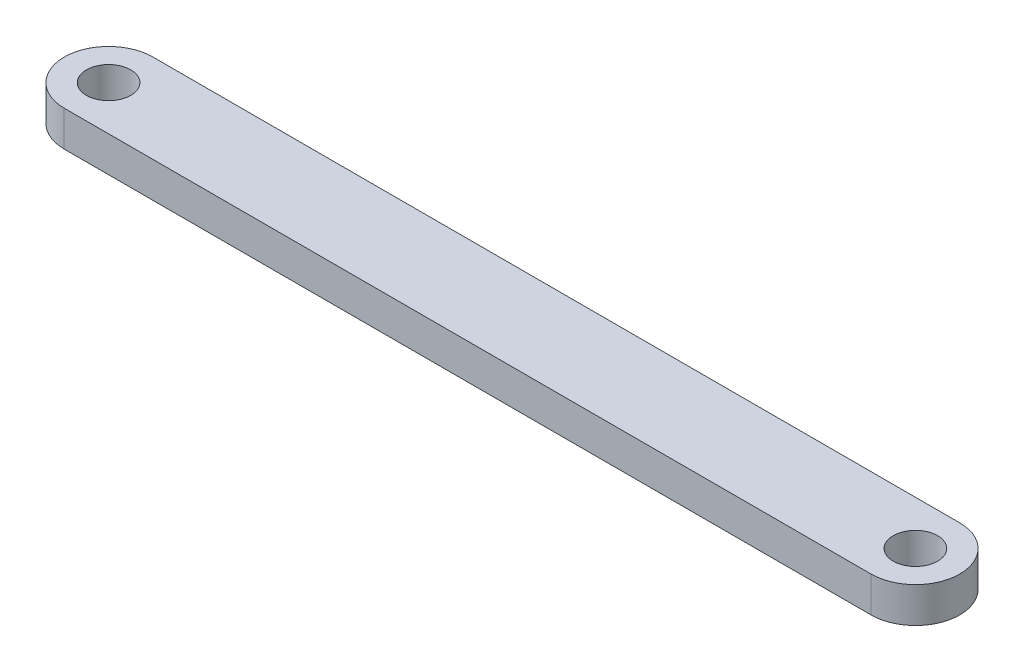
ISO-10303-21;
HEADER;
FILE_DESCRIPTION(('STEP AP214'),'2;1');
FILE_NAME('part.step','',(''),(''),'','','');
FILE_SCHEMA(('AUTOMOTIVE_DESIGN { 1 0 10303 214 1 1 1 1 }'));
ENDSEC;
DATA;
#1=APPLICATION_CONTEXT('core data for automotive mechanical design processes');
#2=APPLICATION_PROTOCOL_DEFINITION('international standard','automotive_design',2000,#1);
#3=PRODUCT_CONTEXT('',#1,'mechanical');
#4=PRODUCT('Part','Part','',(#3));
#5=PRODUCT_RELATED_PRODUCT_CATEGORY('part','',(#4));
#6=PRODUCT_DEFINITION_FORMATION('','',#4);
#7=PRODUCT_DEFINITION_CONTEXT('part definition',#1,'design');
#8=PRODUCT_DEFINITION('design','',#6,#7);
#9=PRODUCT_DEFINITION_SHAPE('','',#8);
#10=(LENGTH_UNIT() NAMED_UNIT(*) SI_UNIT(.MILLI.,.METRE.));
#11=(NAMED_UNIT(*) PLANE_ANGLE_UNIT() SI_UNIT($,.RADIAN.));
#12=(NAMED_UNIT(*) SI_UNIT($,.STERADIAN.) SOLID_ANGLE_UNIT());
#13=UNCERTAINTY_MEASURE_WITH_UNIT(LENGTH_MEASURE(1.E-05),#10,'distance_accuracy_value','');
#14=(GEOMETRIC_REPRESENTATION_CONTEXT(3) GLOBAL_UNCERTAINTY_ASSIGNED_CONTEXT((#13)) GLOBAL_UNIT_ASSIGNED_CONTEXT((#10,
#11,#12)) REPRESENTATION_CONTEXT('',''));
#15=CARTESIAN_POINT('',(0.,0.,0.));
#16=DIRECTION('',(0.,0.,1.));
#17=DIRECTION('',(1.,0.,0.));
#18=AXIS2_PLACEMENT_3D('',#15,#16,#17);
#19=CARTESIAN_POINT('',(0.,20.,25.));
#20=DIRECTION('',(0.,0.,1.));
#21=DIRECTION('',(1.,0.,0.));
#22=AXIS2_PLACEMENT_3D('',#19,#20,#21);
#23=PLANE('',#22);
#24=DIRECTION('',(-1.,0.,0.));
#25=VECTOR('',#24,1.);
#26=CARTESIAN_POINT('',(0.,0.,25.));
#27=LINE('',#26,#25);
#28=CARTESIAN_POINT('',(455.,0.,25.));
#29=VERTEX_POINT('',#28);
#30=CARTESIAN_POINT('',(0.,0.,25.));
#31=VERTEX_POINT('',#30);
#32=EDGE_CURVE('E124',#29,#31,#27,.T.);
#33=ORIENTED_EDGE('',*,*,#32,.F.);
#34=DIRECTION('',(0.,-1.,0.));
#35=VECTOR('',#34,1.);
#36=CARTESIAN_POINT('',(455.,20.,25.));
#37=LINE('',#36,#35);
#38=CARTESIAN_POINT('',(455.,20.,25.));
#39=VERTEX_POINT('',#38);
#40=EDGE_CURVE('E11',#39,#29,#37,.T.);
#41=ORIENTED_EDGE('',*,*,#40,.F.);
#42=DIRECTION('',(-1.,0.,0.));
#43=VECTOR('',#42,1.);
#44=CARTESIAN_POINT('',(0.,20.,25.));
#45=LINE('',#44,#43);
#46=CARTESIAN_POINT('',(0.,20.,25.));
#47=VERTEX_POINT('',#46);
#48=EDGE_CURVE('E97',#39,#47,#45,.T.);
#49=ORIENTED_EDGE('',*,*,#48,.T.);
#50=DIRECTION('',(0.,-1.,0.));
#51=VECTOR('',#50,1.);
#52=CARTESIAN_POINT('',(0.,20.,25.));
#53=LINE('',#52,#51);
#54=EDGE_CURVE('E86',#47,#31,#53,.T.);
#55=ORIENTED_EDGE('',*,*,#54,.T.);
#56=EDGE_LOOP('',(#33,#41,#49,#55));
#57=FACE_BOUND('',#56,.T.);
#58=ADVANCED_FACE('F47',(#57),#23,.T.);
#59=CARTESIAN_POINT('',(455.,20.,0.));
#60=DIRECTION('',(0.,-1.,0.));
#61=DIRECTION('',(0.,0.,-1.));
#62=AXIS2_PLACEMENT_3D('',#59,#60,#61);
#63=CYLINDRICAL_SURFACE('',#62,25.);
#64=CARTESIAN_POINT('',(455.,0.,0.));
#65=DIRECTION('',(0.,1.,0.));
#66=DIRECTION('',(0.,0.,1.));
#67=AXIS2_PLACEMENT_3D('',#64,#65,#66);
#68=CIRCLE('',#67,25.);
#69=CARTESIAN_POINT('',(455.,0.,-25.));
#70=VERTEX_POINT('',#69);
#71=EDGE_CURVE('E104',#29,#70,#68,.T.);
#72=ORIENTED_EDGE('',*,*,#71,.T.);
#73=DIRECTION('',(0.,-1.,0.));
#74=VECTOR('',#73,1.);
#75=CARTESIAN_POINT('',(455.,20.,-25.));
#76=LINE('',#75,#74);
#77=CARTESIAN_POINT('',(455.,20.,-25.));
#78=VERTEX_POINT('',#77);
#79=EDGE_CURVE('E56',#78,#70,#76,.T.);
#80=ORIENTED_EDGE('',*,*,#79,.F.);
#81=CARTESIAN_POINT('',(455.,20.,0.));
#82=DIRECTION('',(0.,1.,0.));
#83=DIRECTION('',(0.,0.,1.));
#84=AXIS2_PLACEMENT_3D('',#81,#82,#83);
#85=CIRCLE('',#84,25.);
#86=EDGE_CURVE('E91',#39,#78,#85,.T.);
#87=ORIENTED_EDGE('',*,*,#86,.F.);
#88=ORIENTED_EDGE('',*,*,#40,.T.);
#89=EDGE_LOOP('',(#72,#80,#87,#88));
#90=FACE_BOUND('',#89,.T.);
#91=ADVANCED_FACE('F102',(#90),#63,.T.);
#92=CARTESIAN_POINT('',(0.,20.,-25.));
#93=DIRECTION('',(0.,0.,-1.));
#94=DIRECTION('',(-1.,0.,0.));
#95=AXIS2_PLACEMENT_3D('',#92,#93,#94);
#96=PLANE('',#95);
#97=DIRECTION('',(1.,0.,0.));
#98=VECTOR('',#97,1.);
#99=CARTESIAN_POINT('',(0.,0.,-25.));
#100=LINE('',#99,#98);
#101=CARTESIAN_POINT('',(0.,0.,-25.));
#102=VERTEX_POINT('',#101);
#103=EDGE_CURVE('E130',#102,#70,#100,.T.);
#104=ORIENTED_EDGE('',*,*,#103,.F.);
#105=DIRECTION('',(0.,-1.,0.));
#106=VECTOR('',#105,1.);
#107=CARTESIAN_POINT('',(0.,20.,-25.));
#108=LINE('',#107,#106);
#109=CARTESIAN_POINT('',(0.,20.,-25.));
#110=VERTEX_POINT('',#109);
#111=EDGE_CURVE('E79',#110,#102,#108,.T.);
#112=ORIENTED_EDGE('',*,*,#111,.F.);
#113=DIRECTION('',(1.,0.,0.));
#114=VECTOR('',#113,1.);
#115=CARTESIAN_POINT('',(0.,20.,-25.));
#116=LINE('',#115,#114);
#117=EDGE_CURVE('E96',#110,#78,#116,.T.);
#118=ORIENTED_EDGE('',*,*,#117,.T.);
#119=ORIENTED_EDGE('',*,*,#79,.T.);
#120=EDGE_LOOP('',(#104,#112,#118,#119));
#121=FACE_BOUND('',#120,.T.);
#122=ADVANCED_FACE('F109',(#121),#96,.T.);
#123=CARTESIAN_POINT('',(455.,20.,0.));
#124=DIRECTION('',(0.,-1.,0.));
#125=DIRECTION('',(0.,0.,-1.));
#126=AXIS2_PLACEMENT_3D('',#123,#124,#125);
#127=CYLINDRICAL_SURFACE('',#126,12.5);
#128=CARTESIAN_POINT('',(455.,20.,0.));
#129=DIRECTION('',(0.,1.,0.));
#130=DIRECTION('',(0.,0.,1.));
#131=AXIS2_PLACEMENT_3D('',#128,#129,#130);
#132=CIRCLE('',#131,12.5);
#133=CARTESIAN_POINT('',(455.,20.,12.5));
#134=VERTEX_POINT('',#133);
#135=EDGE_CURVE('E113',#134,#134,#132,.T.);
#136=ORIENTED_EDGE('',*,*,#135,.T.);
#137=EDGE_LOOP('',(#136));
#138=FACE_BOUND('',#137,.T.);
#139=CARTESIAN_POINT('',(455.,0.,0.));
#140=DIRECTION('',(0.,1.,0.));
#141=DIRECTION('',(0.,0.,1.));
#142=AXIS2_PLACEMENT_3D('',#139,#140,#141);
#143=CIRCLE('',#142,12.5);
#144=CARTESIAN_POINT('',(455.,0.,12.5));
#145=VERTEX_POINT('',#144);
#146=EDGE_CURVE('E136',#145,#145,#143,.T.);
#147=ORIENTED_EDGE('',*,*,#146,.F.);
#148=EDGE_LOOP('',(#147));
#149=FACE_BOUND('',#148,.T.);
#150=ADVANCED_FACE('F157',(#138,#149),#127,.F.);
#151=CARTESIAN_POINT('',(0.,20.,0.));
#152=DIRECTION('',(0.,-1.,0.));
#153=DIRECTION('',(0.,0.,-1.));
#154=AXIS2_PLACEMENT_3D('',#151,#152,#153);
#155=CYLINDRICAL_SURFACE('',#154,25.);
#156=CARTESIAN_POINT('',(0.,0.,0.));
#157=DIRECTION('',(0.,1.,0.));
#158=DIRECTION('',(0.,0.,1.));
#159=AXIS2_PLACEMENT_3D('',#156,#157,#158);
#160=CIRCLE('',#159,25.);
#161=EDGE_CURVE('E133',#102,#31,#160,.T.);
#162=ORIENTED_EDGE('',*,*,#161,.T.);
#163=ORIENTED_EDGE('',*,*,#54,.F.);
#164=CARTESIAN_POINT('',(0.,20.,0.));
#165=DIRECTION('',(0.,1.,0.));
#166=DIRECTION('',(0.,0.,1.));
#167=AXIS2_PLACEMENT_3D('',#164,#165,#166);
#168=CIRCLE('',#167,25.);
#169=EDGE_CURVE('E64',#110,#47,#168,.T.);
#170=ORIENTED_EDGE('',*,*,#169,.F.);
#171=ORIENTED_EDGE('',*,*,#111,.T.);
#172=EDGE_LOOP('',(#162,#163,#170,#171));
#173=FACE_BOUND('',#172,.T.);
#174=ADVANCED_FACE('F160',(#173),#155,.T.);
#175=CARTESIAN_POINT('',(0.,20.,0.));
#176=DIRECTION('',(0.,-1.,0.));
#177=DIRECTION('',(0.,0.,-1.));
#178=AXIS2_PLACEMENT_3D('',#175,#176,#177);
#179=CYLINDRICAL_SURFACE('',#178,12.5);
#180=CARTESIAN_POINT('',(0.,20.,0.));
#181=DIRECTION('',(0.,1.,0.));
#182=DIRECTION('',(0.,0.,1.));
#183=AXIS2_PLACEMENT_3D('',#180,#181,#182);
#184=CIRCLE('',#183,12.5);
#185=CARTESIAN_POINT('',(0.,20.,12.5));
#186=VERTEX_POINT('',#185);
#187=EDGE_CURVE('E120',#186,#186,#184,.T.);
#188=ORIENTED_EDGE('',*,*,#187,.T.);
#189=EDGE_LOOP('',(#188));
#190=FACE_BOUND('',#189,.T.);
#191=CARTESIAN_POINT('',(0.,0.,0.));
#192=DIRECTION('',(0.,1.,0.));
#193=DIRECTION('',(0.,0.,1.));
#194=AXIS2_PLACEMENT_3D('',#191,#192,#193);
#195=CIRCLE('',#194,12.5);
#196=CARTESIAN_POINT('',(0.,0.,12.5));
#197=VERTEX_POINT('',#196);
#198=EDGE_CURVE('E140',#197,#197,#195,.T.);
#199=ORIENTED_EDGE('',*,*,#198,.F.);
#200=EDGE_LOOP('',(#199));
#201=FACE_BOUND('',#200,.T.);
#202=ADVANCED_FACE('F163',(#190,#201),#179,.F.);
#203=CARTESIAN_POINT('',(0.,20.,0.));
#204=DIRECTION('',(0.,1.,0.));
#205=DIRECTION('',(0.,0.,1.));
#206=AXIS2_PLACEMENT_3D('',#203,#204,#205);
#207=PLANE('',#206);
#208=ORIENTED_EDGE('',*,*,#48,.F.);
#209=ORIENTED_EDGE('',*,*,#86,.T.);
#210=ORIENTED_EDGE('',*,*,#117,.F.);
#211=ORIENTED_EDGE('',*,*,#169,.T.);
#212=EDGE_LOOP('',(#208,#209,#210,#211));
#213=FACE_BOUND('',#212,.T.);
#214=ORIENTED_EDGE('',*,*,#135,.F.);
#215=EDGE_LOOP('',(#214));
#216=FACE_BOUND('',#215,.T.);
#217=ORIENTED_EDGE('',*,*,#187,.F.);
#218=EDGE_LOOP('',(#217));
#219=FACE_BOUND('',#218,.T.);
#220=ADVANCED_FACE('F93',(#213,#216,#219),#207,.T.);
#221=CARTESIAN_POINT('',(0.,0.,0.));
#222=DIRECTION('',(0.,1.,0.));
#223=DIRECTION('',(0.,0.,1.));
#224=AXIS2_PLACEMENT_3D('',#221,#222,#223);
#225=PLANE('',#224);
#226=ORIENTED_EDGE('',*,*,#32,.T.);
#227=ORIENTED_EDGE('',*,*,#161,.F.);
#228=ORIENTED_EDGE('',*,*,#103,.T.);
#229=ORIENTED_EDGE('',*,*,#71,.F.);
#230=EDGE_LOOP('',(#226,#227,#228,#229));
#231=FACE_BOUND('',#230,.T.);
#232=ORIENTED_EDGE('',*,*,#146,.T.);
#233=EDGE_LOOP('',(#232));
#234=FACE_BOUND('',#233,.T.);
#235=ORIENTED_EDGE('',*,*,#198,.T.);
#236=EDGE_LOOP('',(#235));
#237=FACE_BOUND('',#236,.T.);
#238=ADVANCED_FACE('F170',(#231,#234,#237),#225,.F.);
#239=CLOSED_SHELL('',(#58,#91,#122,#150,#174,#202,#220,#238));
#240=MANIFOLD_SOLID_BREP('B2',#239);
#241=ADVANCED_BREP_SHAPE_REPRESENTATION('',(#18,#240),#14);
#242=SHAPE_DEFINITION_REPRESENTATION(#9,#241);
ENDSEC;
END-ISO-10303-21;
